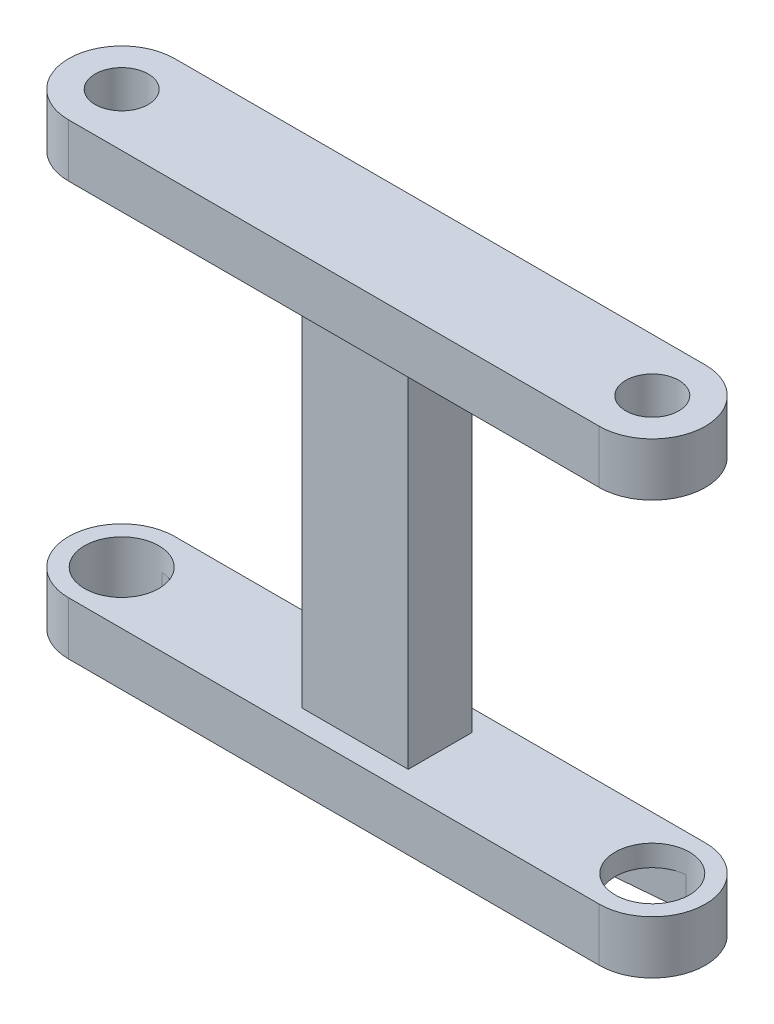
ISO-10303-21;
HEADER;
FILE_DESCRIPTION(('STEP AP214'),'2;1');
FILE_NAME('part.step','',(''),(''),'','','');
FILE_SCHEMA(('AUTOMOTIVE_DESIGN { 1 0 10303 214 1 1 1 1 }'));
ENDSEC;
DATA;
#1=APPLICATION_CONTEXT('core data for automotive mechanical design processes');
#2=APPLICATION_PROTOCOL_DEFINITION('international standard','automotive_design',2000,#1);
#3=PRODUCT_CONTEXT('',#1,'mechanical');
#4=PRODUCT('Part','Part','',(#3));
#5=PRODUCT_RELATED_PRODUCT_CATEGORY('part','',(#4));
#6=PRODUCT_DEFINITION_FORMATION('','',#4);
#7=PRODUCT_DEFINITION_CONTEXT('part definition',#1,'design');
#8=PRODUCT_DEFINITION('design','',#6,#7);
#9=PRODUCT_DEFINITION_SHAPE('','',#8);
#10=(LENGTH_UNIT() NAMED_UNIT(*) SI_UNIT(.MILLI.,.METRE.));
#11=(NAMED_UNIT(*) PLANE_ANGLE_UNIT() SI_UNIT($,.RADIAN.));
#12=(NAMED_UNIT(*) SI_UNIT($,.STERADIAN.) SOLID_ANGLE_UNIT());
#13=UNCERTAINTY_MEASURE_WITH_UNIT(LENGTH_MEASURE(1.E-05),#10,'distance_accuracy_value','');
#14=(GEOMETRIC_REPRESENTATION_CONTEXT(3) GLOBAL_UNCERTAINTY_ASSIGNED_CONTEXT((#13)) GLOBAL_UNIT_ASSIGNED_CONTEXT((#10,
#11,#12)) REPRESENTATION_CONTEXT('',''));
#15=CARTESIAN_POINT('',(0.,0.,0.));
#16=DIRECTION('',(0.,0.,1.));
#17=DIRECTION('',(1.,0.,0.));
#18=AXIS2_PLACEMENT_3D('',#15,#16,#17);
#19=CARTESIAN_POINT('',(0.,0.,0.));
#20=DIRECTION('',(0.,-1.,0.));
#21=DIRECTION('',(0.,0.,-1.));
#22=AXIS2_PLACEMENT_3D('',#19,#20,#21);
#23=PLANE('',#22);
#24=DIRECTION('',(-0.996212107599096,0.,-0.0869565217391309));
#25=VECTOR('',#24,1.);
#26=CARTESIAN_POINT('',(-0.115311909262761,0.,1.3210638818162));
#27=LINE('',#26,#25);
#28=CARTESIAN_POINT('',(24.695652173913,0.,3.48674237659684));
#29=VERTEX_POINT('',#28);
#30=CARTESIAN_POINT('',(8.71739130434783,0.,2.09204542595811));
#31=VERTEX_POINT('',#30);
#32=EDGE_CURVE('E222',#29,#31,#27,.T.);
#33=ORIENTED_EDGE('',*,*,#32,.F.);
#34=CARTESIAN_POINT('',(25.,0.,0.));
#35=DIRECTION('',(0.,-1.,0.));
#36=DIRECTION('',(0.,0.,-1.));
#37=AXIS2_PLACEMENT_3D('',#34,#35,#36);
#38=CIRCLE('',#37,3.5);
#39=CARTESIAN_POINT('',(24.6956521739131,0.,-3.48674237659682));
#40=VERTEX_POINT('',#39);
#41=EDGE_CURVE('E209',#40,#29,#38,.T.);
#42=ORIENTED_EDGE('',*,*,#41,.F.);
#43=DIRECTION('',(-0.996212107599096,0.,0.0869565217391293));
#44=VECTOR('',#43,1.);
#45=CARTESIAN_POINT('',(-0.115311909262759,0.,-1.3210638818162));
#46=LINE('',#45,#44);
#47=CARTESIAN_POINT('',(8.71739130434783,0.,-2.0920454259581));
#48=VERTEX_POINT('',#47);
#49=EDGE_CURVE('E218',#40,#48,#46,.T.);
#50=ORIENTED_EDGE('',*,*,#49,.T.);
#51=CARTESIAN_POINT('',(8.9,0.,0.));
#52=DIRECTION('',(0.,-1.,0.));
#53=DIRECTION('',(0.,0.,-1.));
#54=AXIS2_PLACEMENT_3D('',#51,#52,#53);
#55=CIRCLE('',#54,2.1);
#56=EDGE_CURVE('E225',#48,#31,#55,.F.);
#57=ORIENTED_EDGE('',*,*,#56,.T.);
#58=EDGE_LOOP('',(#33,#42,#50,#57));
#59=FACE_BOUND('',#58,.T.);
#60=DIRECTION('',(-1.,0.,0.));
#61=VECTOR('',#60,1.);
#62=CARTESIAN_POINT('',(-30.,0.,-5.));
#63=LINE('',#62,#61);
#64=CARTESIAN_POINT('',(25.,0.,-5.));
#65=VERTEX_POINT('',#64);
#66=CARTESIAN_POINT('',(-25.,0.,-5.));
#67=VERTEX_POINT('',#66);
#68=EDGE_CURVE('E313',#65,#67,#63,.T.);
#69=ORIENTED_EDGE('',*,*,#68,.F.);
#70=CARTESIAN_POINT('',(25.,0.,0.));
#71=DIRECTION('',(0.,-1.,0.));
#72=DIRECTION('',(0.,0.,-1.));
#73=AXIS2_PLACEMENT_3D('',#70,#71,#72);
#74=CIRCLE('',#73,5.);
#75=CARTESIAN_POINT('',(25.,0.,5.));
#76=VERTEX_POINT('',#75);
#77=EDGE_CURVE('E345',#65,#76,#74,.T.);
#78=ORIENTED_EDGE('',*,*,#77,.T.);
#79=DIRECTION('',(1.,0.,0.));
#80=VECTOR('',#79,1.);
#81=CARTESIAN_POINT('',(-30.,0.,5.));
#82=LINE('',#81,#80);
#83=CARTESIAN_POINT('',(-25.,0.,5.));
#84=VERTEX_POINT('',#83);
#85=EDGE_CURVE('E321',#84,#76,#82,.T.);
#86=ORIENTED_EDGE('',*,*,#85,.F.);
#87=CARTESIAN_POINT('',(-25.,0.,0.));
#88=DIRECTION('',(0.,-1.,0.));
#89=DIRECTION('',(0.,0.,-1.));
#90=AXIS2_PLACEMENT_3D('',#87,#88,#89);
#91=CIRCLE('',#90,5.);
#92=EDGE_CURVE('E332',#84,#67,#91,.T.);
#93=ORIENTED_EDGE('',*,*,#92,.T.);
#94=EDGE_LOOP('',(#69,#78,#86,#93));
#95=FACE_BOUND('',#94,.T.);
#96=DIRECTION('',(0.996212107599096,0.,0.08695652173913));
#97=VECTOR('',#96,1.);
#98=CARTESIAN_POINT('',(0.11531190926276,0.,-1.3210638818162));
#99=LINE('',#98,#97);
#100=CARTESIAN_POINT('',(-24.695652173913,0.,-3.48674237659684));
#101=VERTEX_POINT('',#100);
#102=CARTESIAN_POINT('',(-8.71739130434782,0.,-2.0920454259581));
#103=VERTEX_POINT('',#102);
#104=EDGE_CURVE('E185',#101,#103,#99,.T.);
#105=ORIENTED_EDGE('',*,*,#104,.F.);
#106=CARTESIAN_POINT('',(-25.,0.,0.));
#107=DIRECTION('',(0.,-1.,0.));
#108=DIRECTION('',(0.,0.,-1.));
#109=AXIS2_PLACEMENT_3D('',#106,#107,#108);
#110=CIRCLE('',#109,3.50000000000001);
#111=CARTESIAN_POINT('',(-24.695652173913,0.,3.48674237659683));
#112=VERTEX_POINT('',#111);
#113=EDGE_CURVE('E241',#101,#112,#110,.F.);
#114=ORIENTED_EDGE('',*,*,#113,.T.);
#115=DIRECTION('',(0.996212107599096,0.,-0.0869565217391301));
#116=VECTOR('',#115,1.);
#117=CARTESIAN_POINT('',(0.11531190926276,0.,1.3210638818162));
#118=LINE('',#117,#116);
#119=CARTESIAN_POINT('',(-8.71739130434782,0.,2.0920454259581));
#120=VERTEX_POINT('',#119);
#121=EDGE_CURVE('E197',#112,#120,#118,.T.);
#122=ORIENTED_EDGE('',*,*,#121,.T.);
#123=CARTESIAN_POINT('',(-8.9,0.,0.));
#124=DIRECTION('',(0.,-1.,0.));
#125=DIRECTION('',(0.,0.,-1.));
#126=AXIS2_PLACEMENT_3D('',#123,#124,#125);
#127=CIRCLE('',#126,2.1);
#128=EDGE_CURVE('E200',#103,#120,#127,.T.);
#129=ORIENTED_EDGE('',*,*,#128,.F.);
#130=EDGE_LOOP('',(#105,#114,#122,#129));
#131=FACE_BOUND('',#130,.T.);
#132=ADVANCED_FACE('F41',(#59,#95,#131),#23,.T.);
#133=CARTESIAN_POINT('',(0.,5.,0.));
#134=DIRECTION('',(0.,-1.,0.));
#135=DIRECTION('',(0.,0.,-1.));
#136=AXIS2_PLACEMENT_3D('',#133,#134,#135);
#137=PLANE('',#136);
#138=CARTESIAN_POINT('',(25.,5.,0.));
#139=DIRECTION('',(0.,-1.,0.));
#140=DIRECTION('',(0.,0.,-1.));
#141=AXIS2_PLACEMENT_3D('',#138,#139,#140);
#142=CIRCLE('',#141,3.5);
#143=CARTESIAN_POINT('',(25.,5.,-3.5));
#144=VERTEX_POINT('',#143);
#145=EDGE_CURVE('E244',#144,#144,#142,.T.);
#146=ORIENTED_EDGE('',*,*,#145,.T.);
#147=EDGE_LOOP('',(#146));
#148=FACE_BOUND('',#147,.T.);
#149=DIRECTION('',(1.,0.,0.));
#150=VECTOR('',#149,1.);
#151=CARTESIAN_POINT('',(-30.,5.,5.));
#152=LINE('',#151,#150);
#153=CARTESIAN_POINT('',(-25.,5.,5.));
#154=VERTEX_POINT('',#153);
#155=CARTESIAN_POINT('',(25.,5.,5.));
#156=VERTEX_POINT('',#155);
#157=EDGE_CURVE('E320',#154,#156,#152,.T.);
#158=ORIENTED_EDGE('',*,*,#157,.T.);
#159=CARTESIAN_POINT('',(25.,5.,0.));
#160=DIRECTION('',(0.,-1.,0.));
#161=DIRECTION('',(0.,0.,-1.));
#162=AXIS2_PLACEMENT_3D('',#159,#160,#161);
#163=CIRCLE('',#162,5.);
#164=CARTESIAN_POINT('',(25.,5.,-5.));
#165=VERTEX_POINT('',#164);
#166=EDGE_CURVE('E343',#156,#165,#163,.F.);
#167=ORIENTED_EDGE('',*,*,#166,.T.);
#168=DIRECTION('',(-1.,0.,0.));
#169=VECTOR('',#168,1.);
#170=CARTESIAN_POINT('',(-30.,5.,-5.));
#171=LINE('',#170,#169);
#172=CARTESIAN_POINT('',(-25.,5.,-5.));
#173=VERTEX_POINT('',#172);
#174=EDGE_CURVE('E318',#165,#173,#171,.T.);
#175=ORIENTED_EDGE('',*,*,#174,.T.);
#176=CARTESIAN_POINT('',(-25.,5.,0.));
#177=DIRECTION('',(0.,-1.,0.));
#178=DIRECTION('',(0.,0.,-1.));
#179=AXIS2_PLACEMENT_3D('',#176,#177,#178);
#180=CIRCLE('',#179,5.);
#181=EDGE_CURVE('E335',#173,#154,#180,.F.);
#182=ORIENTED_EDGE('',*,*,#181,.T.);
#183=EDGE_LOOP('',(#158,#167,#175,#182));
#184=FACE_BOUND('',#183,.T.);
#185=DIRECTION('',(1.,0.,0.));
#186=VECTOR('',#185,1.);
#187=CARTESIAN_POINT('',(-13.0000333604002,5.,3.));
#188=LINE('',#187,#186);
#189=CARTESIAN_POINT('',(-4.99996663959976,5.,3.));
#190=VERTEX_POINT('',#189);
#191=CARTESIAN_POINT('',(4.99996663959977,5.,3.));
#192=VERTEX_POINT('',#191);
#193=EDGE_CURVE('E294',#190,#192,#188,.T.);
#194=ORIENTED_EDGE('',*,*,#193,.F.);
#195=DIRECTION('',(0.,0.,-1.));
#196=VECTOR('',#195,1.);
#197=CARTESIAN_POINT('',(-4.99996663959976,5.,0.));
#198=LINE('',#197,#196);
#199=CARTESIAN_POINT('',(-4.99996663959976,5.,-3.));
#200=VERTEX_POINT('',#199);
#201=EDGE_CURVE('E310',#190,#200,#198,.T.);
#202=ORIENTED_EDGE('',*,*,#201,.T.);
#203=DIRECTION('',(1.,0.,0.));
#204=VECTOR('',#203,1.);
#205=CARTESIAN_POINT('',(-13.0000333604002,5.,-3.));
#206=LINE('',#205,#204);
#207=CARTESIAN_POINT('',(4.99996663959977,5.,-3.));
#208=VERTEX_POINT('',#207);
#209=EDGE_CURVE('E295',#200,#208,#206,.T.);
#210=ORIENTED_EDGE('',*,*,#209,.T.);
#211=DIRECTION('',(0.,0.,-1.));
#212=VECTOR('',#211,1.);
#213=CARTESIAN_POINT('',(4.99996663959977,5.,0.));
#214=LINE('',#213,#212);
#215=EDGE_CURVE('E306',#192,#208,#214,.T.);
#216=ORIENTED_EDGE('',*,*,#215,.F.);
#217=EDGE_LOOP('',(#194,#202,#210,#216));
#218=FACE_BOUND('',#217,.T.);
#219=CARTESIAN_POINT('',(-25.,5.,0.));
#220=DIRECTION('',(0.,-1.,0.));
#221=DIRECTION('',(0.,0.,-1.));
#222=AXIS2_PLACEMENT_3D('',#219,#220,#221);
#223=CIRCLE('',#222,3.50000000000001);
#224=CARTESIAN_POINT('',(-25.,5.,-3.50000000000002));
#225=VERTEX_POINT('',#224);
#226=EDGE_CURVE('E237',#225,#225,#223,.F.);
#227=ORIENTED_EDGE('',*,*,#226,.F.);
#228=EDGE_LOOP('',(#227));
#229=FACE_BOUND('',#228,.T.);
#230=ADVANCED_FACE('F368',(#148,#184,#218,#229),#137,.F.);
#231=CARTESIAN_POINT('',(4.99996663959977,39.,0.));
#232=DIRECTION('',(-1.,0.,0.));
#233=DIRECTION('',(0.,0.,1.));
#234=AXIS2_PLACEMENT_3D('',#231,#232,#233);
#235=PLANE('',#234);
#236=DIRECTION('',(0.,-1.,0.));
#237=VECTOR('',#236,1.);
#238=CARTESIAN_POINT('',(4.99996663959977,0.,3.));
#239=LINE('',#238,#237);
#240=CARTESIAN_POINT('',(4.99996663959977,39.,3.));
#241=VERTEX_POINT('',#240);
#242=EDGE_CURVE('E291',#241,#192,#239,.T.);
#243=ORIENTED_EDGE('',*,*,#242,.T.);
#244=ORIENTED_EDGE('',*,*,#215,.T.);
#245=DIRECTION('',(0.,-1.,0.));
#246=VECTOR('',#245,1.);
#247=CARTESIAN_POINT('',(4.99996663959977,0.,-3.));
#248=LINE('',#247,#246);
#249=CARTESIAN_POINT('',(4.99996663959977,39.,-3.));
#250=VERTEX_POINT('',#249);
#251=EDGE_CURVE('E290',#250,#208,#248,.T.);
#252=ORIENTED_EDGE('',*,*,#251,.F.);
#253=DIRECTION('',(0.,0.,-1.));
#254=VECTOR('',#253,1.);
#255=CARTESIAN_POINT('',(4.99996663959977,39.,0.));
#256=LINE('',#255,#254);
#257=EDGE_CURVE('E307',#241,#250,#256,.T.);
#258=ORIENTED_EDGE('',*,*,#257,.F.);
#259=EDGE_LOOP('',(#243,#244,#252,#258));
#260=FACE_BOUND('',#259,.T.);
#261=ADVANCED_FACE('F374',(#260),#235,.F.);
#262=CARTESIAN_POINT('',(-4.99996663959976,39.,0.));
#263=DIRECTION('',(-1.,0.,0.));
#264=DIRECTION('',(0.,0.,1.));
#265=AXIS2_PLACEMENT_3D('',#262,#263,#264);
#266=PLANE('',#265);
#267=ORIENTED_EDGE('',*,*,#201,.F.);
#268=DIRECTION('',(0.,1.,0.));
#269=VECTOR('',#268,1.);
#270=CARTESIAN_POINT('',(-4.99996663959976,39.,3.));
#271=LINE('',#270,#269);
#272=CARTESIAN_POINT('',(-4.99996663959976,39.,3.));
#273=VERTEX_POINT('',#272);
#274=EDGE_CURVE('E303',#190,#273,#271,.T.);
#275=ORIENTED_EDGE('',*,*,#274,.T.);
#276=DIRECTION('',(0.,0.,-1.));
#277=VECTOR('',#276,1.);
#278=CARTESIAN_POINT('',(-4.99996663959976,39.,0.));
#279=LINE('',#278,#277);
#280=CARTESIAN_POINT('',(-4.99996663959976,39.,-3.));
#281=VERTEX_POINT('',#280);
#282=EDGE_CURVE('E309',#273,#281,#279,.T.);
#283=ORIENTED_EDGE('',*,*,#282,.T.);
#284=DIRECTION('',(0.,1.,0.));
#285=VECTOR('',#284,1.);
#286=CARTESIAN_POINT('',(-4.99996663959976,39.,-3.));
#287=LINE('',#286,#285);
#288=EDGE_CURVE('E297',#200,#281,#287,.T.);
#289=ORIENTED_EDGE('',*,*,#288,.F.);
#290=EDGE_LOOP('',(#267,#275,#283,#289));
#291=FACE_BOUND('',#290,.T.);
#292=ADVANCED_FACE('F398',(#291),#266,.T.);
#293=CARTESIAN_POINT('',(25.,5.,0.));
#294=DIRECTION('',(0.,-1.,0.));
#295=DIRECTION('',(0.,0.,-1.));
#296=AXIS2_PLACEMENT_3D('',#293,#294,#295);
#297=CYLINDRICAL_SURFACE('',#296,5.);
#298=DIRECTION('',(0.,-1.,0.));
#299=VECTOR('',#298,1.);
#300=CARTESIAN_POINT('',(25.,5.,-5.));
#301=LINE('',#300,#299);
#302=EDGE_CURVE('E337',#165,#65,#301,.T.);
#303=ORIENTED_EDGE('',*,*,#302,.F.);
#304=ORIENTED_EDGE('',*,*,#166,.F.);
#305=DIRECTION('',(0.,-1.,0.));
#306=VECTOR('',#305,1.);
#307=CARTESIAN_POINT('',(25.,5.,5.));
#308=LINE('',#307,#306);
#309=EDGE_CURVE('E340',#76,#156,#308,.F.);
#310=ORIENTED_EDGE('',*,*,#309,.F.);
#311=ORIENTED_EDGE('',*,*,#77,.F.);
#312=EDGE_LOOP('',(#303,#304,#310,#311));
#313=FACE_BOUND('',#312,.T.);
#314=ADVANCED_FACE('F44',(#313),#297,.T.);
#315=CARTESIAN_POINT('',(-25.,0.,0.));
#316=DIRECTION('',(0.,-1.,0.));
#317=DIRECTION('',(0.,0.,-1.));
#318=AXIS2_PLACEMENT_3D('',#315,#316,#317);
#319=CYLINDRICAL_SURFACE('',#318,5.);
#320=DIRECTION('',(0.,-1.,0.));
#321=VECTOR('',#320,1.);
#322=CARTESIAN_POINT('',(-25.,5.,-5.));
#323=LINE('',#322,#321);
#324=EDGE_CURVE('E323',#67,#173,#323,.F.);
#325=ORIENTED_EDGE('',*,*,#324,.F.);
#326=ORIENTED_EDGE('',*,*,#92,.F.);
#327=DIRECTION('',(0.,-1.,0.));
#328=VECTOR('',#327,1.);
#329=CARTESIAN_POINT('',(-25.,5.,5.));
#330=LINE('',#329,#328);
#331=EDGE_CURVE('E329',#154,#84,#330,.T.);
#332=ORIENTED_EDGE('',*,*,#331,.F.);
#333=ORIENTED_EDGE('',*,*,#181,.F.);
#334=EDGE_LOOP('',(#325,#326,#332,#333));
#335=FACE_BOUND('',#334,.T.);
#336=ADVANCED_FACE('F388',(#335),#319,.T.);
#337=CARTESIAN_POINT('',(-30.,5.,-5.));
#338=DIRECTION('',(0.,0.,1.));
#339=DIRECTION('',(1.,0.,0.));
#340=AXIS2_PLACEMENT_3D('',#337,#338,#339);
#341=PLANE('',#340);
#342=ORIENTED_EDGE('',*,*,#324,.T.);
#343=ORIENTED_EDGE('',*,*,#174,.F.);
#344=ORIENTED_EDGE('',*,*,#302,.T.);
#345=ORIENTED_EDGE('',*,*,#68,.T.);
#346=EDGE_LOOP('',(#342,#343,#344,#345));
#347=FACE_BOUND('',#346,.T.);
#348=ADVANCED_FACE('F385',(#347),#341,.F.);
#349=CARTESIAN_POINT('',(-30.,5.,5.));
#350=DIRECTION('',(0.,0.,-1.));
#351=DIRECTION('',(-1.,0.,0.));
#352=AXIS2_PLACEMENT_3D('',#349,#350,#351);
#353=PLANE('',#352);
#354=ORIENTED_EDGE('',*,*,#309,.T.);
#355=ORIENTED_EDGE('',*,*,#157,.F.);
#356=ORIENTED_EDGE('',*,*,#331,.T.);
#357=ORIENTED_EDGE('',*,*,#85,.T.);
#358=EDGE_LOOP('',(#354,#355,#356,#357));
#359=FACE_BOUND('',#358,.T.);
#360=ADVANCED_FACE('F381',(#359),#353,.F.);
#361=CARTESIAN_POINT('',(-13.0000333604002,0.,-3.));
#362=DIRECTION('',(0.,0.,1.));
#363=DIRECTION('',(0.,-1.,0.));
#364=AXIS2_PLACEMENT_3D('',#361,#362,#363);
#365=PLANE('',#364);
#366=ORIENTED_EDGE('',*,*,#288,.T.);
#367=DIRECTION('',(1.,0.,0.));
#368=VECTOR('',#367,1.);
#369=CARTESIAN_POINT('',(0.,39.,-3.));
#370=LINE('',#369,#368);
#371=EDGE_CURVE('E347',#281,#250,#370,.T.);
#372=ORIENTED_EDGE('',*,*,#371,.T.);
#373=ORIENTED_EDGE('',*,*,#251,.T.);
#374=ORIENTED_EDGE('',*,*,#209,.F.);
#375=EDGE_LOOP('',(#366,#372,#373,#374));
#376=FACE_BOUND('',#375,.T.);
#377=ADVANCED_FACE('F384',(#376),#365,.F.);
#378=CARTESIAN_POINT('',(-13.0000333604002,0.,3.));
#379=DIRECTION('',(0.,0.,1.));
#380=DIRECTION('',(0.,-1.,0.));
#381=AXIS2_PLACEMENT_3D('',#378,#379,#380);
#382=PLANE('',#381);
#383=ORIENTED_EDGE('',*,*,#193,.T.);
#384=ORIENTED_EDGE('',*,*,#242,.F.);
#385=DIRECTION('',(1.,0.,0.));
#386=VECTOR('',#385,1.);
#387=CARTESIAN_POINT('',(0.,39.,3.));
#388=LINE('',#387,#386);
#389=EDGE_CURVE('E350',#273,#241,#388,.T.);
#390=ORIENTED_EDGE('',*,*,#389,.F.);
#391=ORIENTED_EDGE('',*,*,#274,.F.);
#392=EDGE_LOOP('',(#383,#384,#390,#391));
#393=FACE_BOUND('',#392,.T.);
#394=ADVANCED_FACE('F460',(#393),#382,.T.);
#395=CARTESIAN_POINT('',(-25.,44.,0.));
#396=DIRECTION('',(0.,-1.,0.));
#397=DIRECTION('',(0.,0.,-1.));
#398=AXIS2_PLACEMENT_3D('',#395,#396,#397);
#399=CYLINDRICAL_SURFACE('',#398,5.);
#400=CARTESIAN_POINT('',(-25.,39.,0.));
#401=DIRECTION('',(0.,1.,0.));
#402=DIRECTION('',(0.,0.,1.));
#403=AXIS2_PLACEMENT_3D('',#400,#401,#402);
#404=CIRCLE('',#403,5.);
#405=CARTESIAN_POINT('',(-25.,39.,-5.));
#406=VERTEX_POINT('',#405);
#407=CARTESIAN_POINT('',(-25.,39.,5.));
#408=VERTEX_POINT('',#407);
#409=EDGE_CURVE('E252',#406,#408,#404,.T.);
#410=ORIENTED_EDGE('',*,*,#409,.T.);
#411=DIRECTION('',(0.,-1.,0.));
#412=VECTOR('',#411,1.);
#413=CARTESIAN_POINT('',(-25.,44.,5.));
#414=LINE('',#413,#412);
#415=CARTESIAN_POINT('',(-25.,44.,5.));
#416=VERTEX_POINT('',#415);
#417=EDGE_CURVE('E287',#416,#408,#414,.T.);
#418=ORIENTED_EDGE('',*,*,#417,.F.);
#419=CARTESIAN_POINT('',(-25.,44.,0.));
#420=DIRECTION('',(0.,1.,0.));
#421=DIRECTION('',(0.,0.,1.));
#422=AXIS2_PLACEMENT_3D('',#419,#420,#421);
#423=CIRCLE('',#422,5.);
#424=CARTESIAN_POINT('',(-25.,44.,-5.));
#425=VERTEX_POINT('',#424);
#426=EDGE_CURVE('E261',#425,#416,#423,.T.);
#427=ORIENTED_EDGE('',*,*,#426,.F.);
#428=DIRECTION('',(0.,-1.,0.));
#429=VECTOR('',#428,1.);
#430=CARTESIAN_POINT('',(-25.,44.,-5.));
#431=LINE('',#430,#429);
#432=EDGE_CURVE('E271',#425,#406,#431,.T.);
#433=ORIENTED_EDGE('',*,*,#432,.T.);
#434=EDGE_LOOP('',(#410,#418,#427,#433));
#435=FACE_BOUND('',#434,.T.);
#436=ADVANCED_FACE('F456',(#435),#399,.T.);
#437=CARTESIAN_POINT('',(-25.,44.,5.));
#438=DIRECTION('',(0.,0.,-1.));
#439=DIRECTION('',(-1.,0.,0.));
#440=AXIS2_PLACEMENT_3D('',#437,#438,#439);
#441=PLANE('',#440);
#442=DIRECTION('',(1.,0.,0.));
#443=VECTOR('',#442,1.);
#444=CARTESIAN_POINT('',(-25.,39.,5.));
#445=LINE('',#444,#443);
#446=CARTESIAN_POINT('',(25.,39.,5.));
#447=VERTEX_POINT('',#446);
#448=EDGE_CURVE('E274',#408,#447,#445,.T.);
#449=ORIENTED_EDGE('',*,*,#448,.T.);
#450=DIRECTION('',(0.,-1.,0.));
#451=VECTOR('',#450,1.);
#452=CARTESIAN_POINT('',(25.,44.,5.));
#453=LINE('',#452,#451);
#454=CARTESIAN_POINT('',(25.,44.,5.));
#455=VERTEX_POINT('',#454);
#456=EDGE_CURVE('E284',#455,#447,#453,.T.);
#457=ORIENTED_EDGE('',*,*,#456,.F.);
#458=DIRECTION('',(1.,0.,0.));
#459=VECTOR('',#458,1.);
#460=CARTESIAN_POINT('',(-25.,44.,5.));
#461=LINE('',#460,#459);
#462=EDGE_CURVE('E264',#416,#455,#461,.T.);
#463=ORIENTED_EDGE('',*,*,#462,.F.);
#464=ORIENTED_EDGE('',*,*,#417,.T.);
#465=EDGE_LOOP('',(#449,#457,#463,#464));
#466=FACE_BOUND('',#465,.T.);
#467=ADVANCED_FACE('F452',(#466),#441,.F.);
#468=CARTESIAN_POINT('',(25.,44.,0.));
#469=DIRECTION('',(0.,-1.,0.));
#470=DIRECTION('',(0.,0.,-1.));
#471=AXIS2_PLACEMENT_3D('',#468,#469,#470);
#472=CYLINDRICAL_SURFACE('',#471,5.);
#473=CARTESIAN_POINT('',(25.,39.,0.));
#474=DIRECTION('',(0.,1.,0.));
#475=DIRECTION('',(0.,0.,1.));
#476=AXIS2_PLACEMENT_3D('',#473,#474,#475);
#477=CIRCLE('',#476,5.);
#478=CARTESIAN_POINT('',(25.,39.,-5.));
#479=VERTEX_POINT('',#478);
#480=EDGE_CURVE('E276',#447,#479,#477,.T.);
#481=ORIENTED_EDGE('',*,*,#480,.T.);
#482=DIRECTION('',(0.,-1.,0.));
#483=VECTOR('',#482,1.);
#484=CARTESIAN_POINT('',(25.,44.,-5.));
#485=LINE('',#484,#483);
#486=CARTESIAN_POINT('',(25.,44.,-5.));
#487=VERTEX_POINT('',#486);
#488=EDGE_CURVE('E281',#487,#479,#485,.T.);
#489=ORIENTED_EDGE('',*,*,#488,.F.);
#490=CARTESIAN_POINT('',(25.,44.,0.));
#491=DIRECTION('',(0.,1.,0.));
#492=DIRECTION('',(0.,0.,1.));
#493=AXIS2_PLACEMENT_3D('',#490,#491,#492);
#494=CIRCLE('',#493,5.);
#495=EDGE_CURVE('E267',#455,#487,#494,.T.);
#496=ORIENTED_EDGE('',*,*,#495,.F.);
#497=ORIENTED_EDGE('',*,*,#456,.T.);
#498=EDGE_LOOP('',(#481,#489,#496,#497));
#499=FACE_BOUND('',#498,.T.);
#500=ADVANCED_FACE('F448',(#499),#472,.T.);
#501=CARTESIAN_POINT('',(25.,44.,-5.));
#502=DIRECTION('',(0.,0.,1.));
#503=DIRECTION('',(1.,0.,0.));
#504=AXIS2_PLACEMENT_3D('',#501,#502,#503);
#505=PLANE('',#504);
#506=DIRECTION('',(-1.,0.,0.));
#507=VECTOR('',#506,1.);
#508=CARTESIAN_POINT('',(25.,39.,-5.));
#509=LINE('',#508,#507);
#510=EDGE_CURVE('E265',#479,#406,#509,.T.);
#511=ORIENTED_EDGE('',*,*,#510,.T.);
#512=ORIENTED_EDGE('',*,*,#432,.F.);
#513=DIRECTION('',(-1.,0.,0.));
#514=VECTOR('',#513,1.);
#515=CARTESIAN_POINT('',(25.,44.,-5.));
#516=LINE('',#515,#514);
#517=EDGE_CURVE('E269',#487,#425,#516,.T.);
#518=ORIENTED_EDGE('',*,*,#517,.F.);
#519=ORIENTED_EDGE('',*,*,#488,.T.);
#520=EDGE_LOOP('',(#511,#512,#518,#519));
#521=FACE_BOUND('',#520,.T.);
#522=ADVANCED_FACE('F441',(#521),#505,.F.);
#523=CARTESIAN_POINT('',(-25.,44.,0.));
#524=DIRECTION('',(0.,1.,0.));
#525=DIRECTION('',(0.,0.,1.));
#526=AXIS2_PLACEMENT_3D('',#523,#524,#525);
#527=PLANE('',#526);
#528=CARTESIAN_POINT('',(-25.,44.,0.));
#529=DIRECTION('',(0.,1.,0.));
#530=DIRECTION('',(0.,0.,1.));
#531=AXIS2_PLACEMENT_3D('',#528,#529,#530);
#532=CIRCLE('',#531,2.5);
#533=CARTESIAN_POINT('',(-25.,44.,2.5));
#534=VERTEX_POINT('',#533);
#535=EDGE_CURVE('E253',#534,#534,#532,.T.);
#536=ORIENTED_EDGE('',*,*,#535,.F.);
#537=EDGE_LOOP('',(#536));
#538=FACE_BOUND('',#537,.T.);
#539=CARTESIAN_POINT('',(25.,44.,0.));
#540=DIRECTION('',(0.,1.,0.));
#541=DIRECTION('',(0.,0.,-1.));
#542=AXIS2_PLACEMENT_3D('',#539,#540,#541);
#543=CIRCLE('',#542,2.49999999999999);
#544=CARTESIAN_POINT('',(25.,44.,-2.49999999999997));
#545=VERTEX_POINT('',#544);
#546=EDGE_CURVE('E256',#545,#545,#543,.T.);
#547=ORIENTED_EDGE('',*,*,#546,.F.);
#548=EDGE_LOOP('',(#547));
#549=FACE_BOUND('',#548,.T.);
#550=ORIENTED_EDGE('',*,*,#426,.T.);
#551=ORIENTED_EDGE('',*,*,#462,.T.);
#552=ORIENTED_EDGE('',*,*,#495,.T.);
#553=ORIENTED_EDGE('',*,*,#517,.T.);
#554=EDGE_LOOP('',(#550,#551,#552,#553));
#555=FACE_BOUND('',#554,.T.);
#556=ADVANCED_FACE('F438',(#538,#549,#555),#527,.T.);
#557=CARTESIAN_POINT('',(-25.,39.,0.));
#558=DIRECTION('',(0.,1.,0.));
#559=DIRECTION('',(0.,0.,1.));
#560=AXIS2_PLACEMENT_3D('',#557,#558,#559);
#561=PLANE('',#560);
#562=CARTESIAN_POINT('',(-25.,39.,0.));
#563=DIRECTION('',(0.,1.,0.));
#564=DIRECTION('',(0.,0.,1.));
#565=AXIS2_PLACEMENT_3D('',#562,#563,#564);
#566=CIRCLE('',#565,2.5);
#567=CARTESIAN_POINT('',(-25.,39.,2.5));
#568=VERTEX_POINT('',#567);
#569=EDGE_CURVE('E249',#568,#568,#566,.T.);
#570=ORIENTED_EDGE('',*,*,#569,.T.);
#571=EDGE_LOOP('',(#570));
#572=FACE_BOUND('',#571,.T.);
#573=CARTESIAN_POINT('',(25.,39.,0.));
#574=DIRECTION('',(0.,1.,0.));
#575=DIRECTION('',(0.,0.,-1.));
#576=AXIS2_PLACEMENT_3D('',#573,#574,#575);
#577=CIRCLE('',#576,2.49999999999999);
#578=CARTESIAN_POINT('',(25.,39.,-2.49999999999997));
#579=VERTEX_POINT('',#578);
#580=EDGE_CURVE('E240',#579,#579,#577,.T.);
#581=ORIENTED_EDGE('',*,*,#580,.T.);
#582=EDGE_LOOP('',(#581));
#583=FACE_BOUND('',#582,.T.);
#584=ORIENTED_EDGE('',*,*,#282,.F.);
#585=ORIENTED_EDGE('',*,*,#389,.T.);
#586=ORIENTED_EDGE('',*,*,#257,.T.);
#587=ORIENTED_EDGE('',*,*,#371,.F.);
#588=EDGE_LOOP('',(#584,#585,#586,#587));
#589=FACE_BOUND('',#588,.T.);
#590=ORIENTED_EDGE('',*,*,#409,.F.);
#591=ORIENTED_EDGE('',*,*,#510,.F.);
#592=ORIENTED_EDGE('',*,*,#480,.F.);
#593=ORIENTED_EDGE('',*,*,#448,.F.);
#594=EDGE_LOOP('',(#590,#591,#592,#593));
#595=FACE_BOUND('',#594,.T.);
#596=ADVANCED_FACE('F436',(#572,#583,#589,#595),#561,.F.);
#597=CARTESIAN_POINT('',(25.,39.,0.));
#598=DIRECTION('',(0.,1.,0.));
#599=DIRECTION('',(0.,0.,1.));
#600=AXIS2_PLACEMENT_3D('',#597,#598,#599);
#601=CYLINDRICAL_SURFACE('',#600,2.49999999999999);
#602=ORIENTED_EDGE('',*,*,#580,.F.);
#603=EDGE_LOOP('',(#602));
#604=FACE_BOUND('',#603,.T.);
#605=ORIENTED_EDGE('',*,*,#546,.T.);
#606=EDGE_LOOP('',(#605));
#607=FACE_BOUND('',#606,.T.);
#608=ADVANCED_FACE('F432',(#604,#607),#601,.F.);
#609=CARTESIAN_POINT('',(-25.,39.,0.));
#610=DIRECTION('',(0.,1.,0.));
#611=DIRECTION('',(0.,0.,1.));
#612=AXIS2_PLACEMENT_3D('',#609,#610,#611);
#613=CYLINDRICAL_SURFACE('',#612,2.5);
#614=ORIENTED_EDGE('',*,*,#569,.F.);
#615=EDGE_LOOP('',(#614));
#616=FACE_BOUND('',#615,.T.);
#617=ORIENTED_EDGE('',*,*,#535,.T.);
#618=EDGE_LOOP('',(#617));
#619=FACE_BOUND('',#618,.T.);
#620=ADVANCED_FACE('F423',(#616,#619),#613,.F.);
#621=CARTESIAN_POINT('',(25.,5.,0.));
#622=DIRECTION('',(0.,-1.,0.));
#623=DIRECTION('',(0.,0.,-1.));
#624=AXIS2_PLACEMENT_3D('',#621,#622,#623);
#625=CYLINDRICAL_SURFACE('',#624,3.5);
#626=ORIENTED_EDGE('',*,*,#41,.T.);
#627=DIRECTION('',(0.,-1.,0.));
#628=VECTOR('',#627,1.);
#629=CARTESIAN_POINT('',(24.695652173913,3.,3.48674237659684));
#630=LINE('',#629,#628);
#631=CARTESIAN_POINT('',(24.695652173913,3.,3.48674237659684));
#632=VERTEX_POINT('',#631);
#633=EDGE_CURVE('E205',#632,#29,#630,.T.);
#634=ORIENTED_EDGE('',*,*,#633,.F.);
#635=CARTESIAN_POINT('',(25.,3.,0.));
#636=DIRECTION('',(0.,-1.,0.));
#637=DIRECTION('',(0.,0.,-1.));
#638=AXIS2_PLACEMENT_3D('',#635,#636,#637);
#639=CIRCLE('',#638,3.5);
#640=CARTESIAN_POINT('',(24.6956521739131,3.,-3.48674237659683));
#641=VERTEX_POINT('',#640);
#642=EDGE_CURVE('E11',#641,#632,#639,.F.);
#643=ORIENTED_EDGE('',*,*,#642,.F.);
#644=DIRECTION('',(0.,-1.,0.));
#645=VECTOR('',#644,1.);
#646=CARTESIAN_POINT('',(24.6956521739131,3.,-3.48674237659682));
#647=LINE('',#646,#645);
#648=EDGE_CURVE('E231',#641,#40,#647,.T.);
#649=ORIENTED_EDGE('',*,*,#648,.T.);
#650=EDGE_LOOP('',(#626,#634,#643,#649));
#651=FACE_BOUND('',#650,.T.);
#652=ORIENTED_EDGE('',*,*,#145,.F.);
#653=EDGE_LOOP('',(#652));
#654=FACE_BOUND('',#653,.T.);
#655=ADVANCED_FACE('F418',(#651,#654),#625,.F.);
#656=CARTESIAN_POINT('',(-25.,5.,0.));
#657=DIRECTION('',(0.,-1.,0.));
#658=DIRECTION('',(0.,0.,-1.));
#659=AXIS2_PLACEMENT_3D('',#656,#657,#658);
#660=CYLINDRICAL_SURFACE('',#659,3.50000000000001);
#661=DIRECTION('',(0.,-1.,0.));
#662=VECTOR('',#661,1.);
#663=CARTESIAN_POINT('',(-24.695652173913,3.,-3.48674237659684));
#664=LINE('',#663,#662);
#665=CARTESIAN_POINT('',(-24.695652173913,3.,-3.48674237659684));
#666=VERTEX_POINT('',#665);
#667=EDGE_CURVE('E207',#666,#101,#664,.T.);
#668=ORIENTED_EDGE('',*,*,#667,.F.);
#669=CARTESIAN_POINT('',(-25.,3.,0.));
#670=DIRECTION('',(0.,-1.,0.));
#671=DIRECTION('',(0.,0.,-1.));
#672=AXIS2_PLACEMENT_3D('',#669,#670,#671);
#673=CIRCLE('',#672,3.50000000000001);
#674=CARTESIAN_POINT('',(-24.695652173913,3.,3.48674237659682));
#675=VERTEX_POINT('',#674);
#676=EDGE_CURVE('E50',#666,#675,#673,.T.);
#677=ORIENTED_EDGE('',*,*,#676,.T.);
#678=DIRECTION('',(0.,-1.,0.));
#679=VECTOR('',#678,1.);
#680=CARTESIAN_POINT('',(-24.695652173913,3.,3.48674237659683));
#681=LINE('',#680,#679);
#682=EDGE_CURVE('E210',#675,#112,#681,.T.);
#683=ORIENTED_EDGE('',*,*,#682,.T.);
#684=ORIENTED_EDGE('',*,*,#113,.F.);
#685=EDGE_LOOP('',(#668,#677,#683,#684));
#686=FACE_BOUND('',#685,.T.);
#687=ORIENTED_EDGE('',*,*,#226,.T.);
#688=EDGE_LOOP('',(#687));
#689=FACE_BOUND('',#688,.T.);
#690=ADVANCED_FACE('F352',(#686,#689),#660,.F.);
#691=CARTESIAN_POINT('',(0.11531190926276,3.,-1.3210638818162));
#692=DIRECTION('',(0.08695652173913,0.,-0.996212107599096));
#693=DIRECTION('',(-0.996212107599096,0.,-0.08695652173913));
#694=AXIS2_PLACEMENT_3D('',#691,#692,#693);
#695=PLANE('',#694);
#696=ORIENTED_EDGE('',*,*,#104,.T.);
#697=DIRECTION('',(0.,-1.,0.));
#698=VECTOR('',#697,1.);
#699=CARTESIAN_POINT('',(-8.71739130434782,3.,-2.0920454259581));
#700=LINE('',#699,#698);
#701=CARTESIAN_POINT('',(-8.71739130434782,3.,-2.0920454259581));
#702=VERTEX_POINT('',#701);
#703=EDGE_CURVE('E178',#702,#103,#700,.T.);
#704=ORIENTED_EDGE('',*,*,#703,.F.);
#705=DIRECTION('',(0.996212107599096,0.,0.08695652173913));
#706=VECTOR('',#705,1.);
#707=CARTESIAN_POINT('',(0.11531190926276,3.,-1.3210638818162));
#708=LINE('',#707,#706);
#709=EDGE_CURVE('E182',#666,#702,#708,.T.);
#710=ORIENTED_EDGE('',*,*,#709,.F.);
#711=ORIENTED_EDGE('',*,*,#667,.T.);
#712=EDGE_LOOP('',(#696,#704,#710,#711));
#713=FACE_BOUND('',#712,.T.);
#714=ADVANCED_FACE('F180',(#713),#695,.F.);
#715=CARTESIAN_POINT('',(0.11531190926276,3.,1.3210638818162));
#716=DIRECTION('',(-0.0869565217391301,0.,-0.996212107599096));
#717=DIRECTION('',(-0.996212107599096,0.,0.0869565217391301));
#718=AXIS2_PLACEMENT_3D('',#715,#716,#717);
#719=PLANE('',#718);
#720=ORIENTED_EDGE('',*,*,#121,.F.);
#721=ORIENTED_EDGE('',*,*,#682,.F.);
#722=DIRECTION('',(0.996212107599096,0.,-0.0869565217391301));
#723=VECTOR('',#722,1.);
#724=CARTESIAN_POINT('',(0.11531190926276,3.,1.3210638818162));
#725=LINE('',#724,#723);
#726=CARTESIAN_POINT('',(-8.71739130434782,3.,2.0920454259581));
#727=VERTEX_POINT('',#726);
#728=EDGE_CURVE('E64',#675,#727,#725,.T.);
#729=ORIENTED_EDGE('',*,*,#728,.T.);
#730=DIRECTION('',(0.,-1.,0.));
#731=VECTOR('',#730,1.);
#732=CARTESIAN_POINT('',(-8.71739130434782,3.,2.0920454259581));
#733=LINE('',#732,#731);
#734=EDGE_CURVE('E189',#727,#120,#733,.T.);
#735=ORIENTED_EDGE('',*,*,#734,.T.);
#736=EDGE_LOOP('',(#720,#721,#729,#735));
#737=FACE_BOUND('',#736,.T.);
#738=ADVANCED_FACE('F357',(#737),#719,.T.);
#739=CARTESIAN_POINT('',(-8.9,3.,0.));
#740=DIRECTION('',(0.,-1.,0.));
#741=DIRECTION('',(0.,0.,-1.));
#742=AXIS2_PLACEMENT_3D('',#739,#740,#741);
#743=CYLINDRICAL_SURFACE('',#742,2.1);
#744=ORIENTED_EDGE('',*,*,#128,.T.);
#745=ORIENTED_EDGE('',*,*,#734,.F.);
#746=CARTESIAN_POINT('',(-8.9,3.,0.));
#747=DIRECTION('',(0.,-1.,0.));
#748=DIRECTION('',(0.,0.,-1.));
#749=AXIS2_PLACEMENT_3D('',#746,#747,#748);
#750=CIRCLE('',#749,2.1);
#751=EDGE_CURVE('E192',#702,#727,#750,.T.);
#752=ORIENTED_EDGE('',*,*,#751,.F.);
#753=ORIENTED_EDGE('',*,*,#703,.T.);
#754=EDGE_LOOP('',(#744,#745,#752,#753));
#755=FACE_BOUND('',#754,.T.);
#756=ADVANCED_FACE('F193',(#755),#743,.F.);
#757=CARTESIAN_POINT('',(0.,3.,0.));
#758=DIRECTION('',(0.,-1.,0.));
#759=DIRECTION('',(0.,0.,-1.));
#760=AXIS2_PLACEMENT_3D('',#757,#758,#759);
#761=PLANE('',#760);
#762=ORIENTED_EDGE('',*,*,#709,.T.);
#763=ORIENTED_EDGE('',*,*,#751,.T.);
#764=ORIENTED_EDGE('',*,*,#728,.F.);
#765=ORIENTED_EDGE('',*,*,#676,.F.);
#766=EDGE_LOOP('',(#762,#763,#764,#765));
#767=FACE_BOUND('',#766,.T.);
#768=ADVANCED_FACE('F195',(#767),#761,.T.);
#769=CARTESIAN_POINT('',(0.,3.,0.));
#770=DIRECTION('',(0.,-1.,0.));
#771=DIRECTION('',(0.,0.,-1.));
#772=AXIS2_PLACEMENT_3D('',#769,#770,#771);
#773=PLANE('',#772);
#774=ORIENTED_EDGE('',*,*,#642,.T.);
#775=DIRECTION('',(-0.996212107599096,0.,-0.0869565217391309));
#776=VECTOR('',#775,1.);
#777=CARTESIAN_POINT('',(-0.115311909262761,3.,1.3210638818162));
#778=LINE('',#777,#776);
#779=CARTESIAN_POINT('',(8.71739130434783,3.,2.09204542595811));
#780=VERTEX_POINT('',#779);
#781=EDGE_CURVE('E214',#632,#780,#778,.T.);
#782=ORIENTED_EDGE('',*,*,#781,.T.);
#783=CARTESIAN_POINT('',(8.9,3.,0.));
#784=DIRECTION('',(0.,-1.,0.));
#785=DIRECTION('',(0.,0.,-1.));
#786=AXIS2_PLACEMENT_3D('',#783,#784,#785);
#787=CIRCLE('',#786,2.1);
#788=CARTESIAN_POINT('',(8.71739130434783,3.,-2.0920454259581));
#789=VERTEX_POINT('',#788);
#790=EDGE_CURVE('E217',#789,#780,#787,.F.);
#791=ORIENTED_EDGE('',*,*,#790,.F.);
#792=DIRECTION('',(-0.996212107599096,0.,0.0869565217391293));
#793=VECTOR('',#792,1.);
#794=CARTESIAN_POINT('',(-0.115311909262759,3.,-1.3210638818162));
#795=LINE('',#794,#793);
#796=EDGE_CURVE('E56',#641,#789,#795,.T.);
#797=ORIENTED_EDGE('',*,*,#796,.F.);
#798=EDGE_LOOP('',(#774,#782,#791,#797));
#799=FACE_BOUND('',#798,.T.);
#800=ADVANCED_FACE('F605',(#799),#773,.T.);
#801=CARTESIAN_POINT('',(-0.115311909262761,3.,1.3210638818162));
#802=DIRECTION('',(-0.0869565217391308,0.,0.996212107599095));
#803=DIRECTION('',(0.996212107599096,0.,0.0869565217391308));
#804=AXIS2_PLACEMENT_3D('',#801,#802,#803);
#805=PLANE('',#804);
#806=ORIENTED_EDGE('',*,*,#32,.T.);
#807=DIRECTION('',(0.,-1.,0.));
#808=VECTOR('',#807,1.);
#809=CARTESIAN_POINT('',(8.71739130434783,3.,2.09204542595811));
#810=LINE('',#809,#808);
#811=EDGE_CURVE('E221',#780,#31,#810,.T.);
#812=ORIENTED_EDGE('',*,*,#811,.F.);
#813=ORIENTED_EDGE('',*,*,#781,.F.);
#814=ORIENTED_EDGE('',*,*,#633,.T.);
#815=EDGE_LOOP('',(#806,#812,#813,#814));
#816=FACE_BOUND('',#815,.T.);
#817=ADVANCED_FACE('F427',(#816),#805,.F.);
#818=CARTESIAN_POINT('',(-0.115311909262759,3.,-1.3210638818162));
#819=DIRECTION('',(0.0869565217391293,0.,0.996212107599096));
#820=DIRECTION('',(0.996212107599096,0.,-0.0869565217391293));
#821=AXIS2_PLACEMENT_3D('',#818,#819,#820);
#822=PLANE('',#821);
#823=ORIENTED_EDGE('',*,*,#49,.F.);
#824=ORIENTED_EDGE('',*,*,#648,.F.);
#825=ORIENTED_EDGE('',*,*,#796,.T.);
#826=DIRECTION('',(0.,-1.,0.));
#827=VECTOR('',#826,1.);
#828=CARTESIAN_POINT('',(8.71739130434783,3.,-2.0920454259581));
#829=LINE('',#828,#827);
#830=EDGE_CURVE('E234',#789,#48,#829,.T.);
#831=ORIENTED_EDGE('',*,*,#830,.T.);
#832=EDGE_LOOP('',(#823,#824,#825,#831));
#833=FACE_BOUND('',#832,.T.);
#834=ADVANCED_FACE('F624',(#833),#822,.T.);
#835=CARTESIAN_POINT('',(8.9,3.,0.));
#836=DIRECTION('',(0.,-1.,0.));
#837=DIRECTION('',(0.,0.,-1.));
#838=AXIS2_PLACEMENT_3D('',#835,#836,#837);
#839=CYLINDRICAL_SURFACE('',#838,2.1);
#840=ORIENTED_EDGE('',*,*,#56,.F.);
#841=ORIENTED_EDGE('',*,*,#830,.F.);
#842=ORIENTED_EDGE('',*,*,#790,.T.);
#843=ORIENTED_EDGE('',*,*,#811,.T.);
#844=EDGE_LOOP('',(#840,#841,#842,#843));
#845=FACE_BOUND('',#844,.T.);
#846=ADVANCED_FACE('F634',(#845),#839,.F.);
#847=CLOSED_SHELL('',(#132,#230,#261,#292,#314,#336,#348,#360,#377,#394,#436,#467,#500,#522,
#556,#596,#608,#620,#655,#690,#714,#738,#756,#768,#800,#817,#834,#846));
#848=MANIFOLD_SOLID_BREP('B2',#847);
#849=ADVANCED_BREP_SHAPE_REPRESENTATION('',(#18,#848),#14);
#850=SHAPE_DEFINITION_REPRESENTATION(#9,#849);
ENDSEC;
END-ISO-10303-21;
